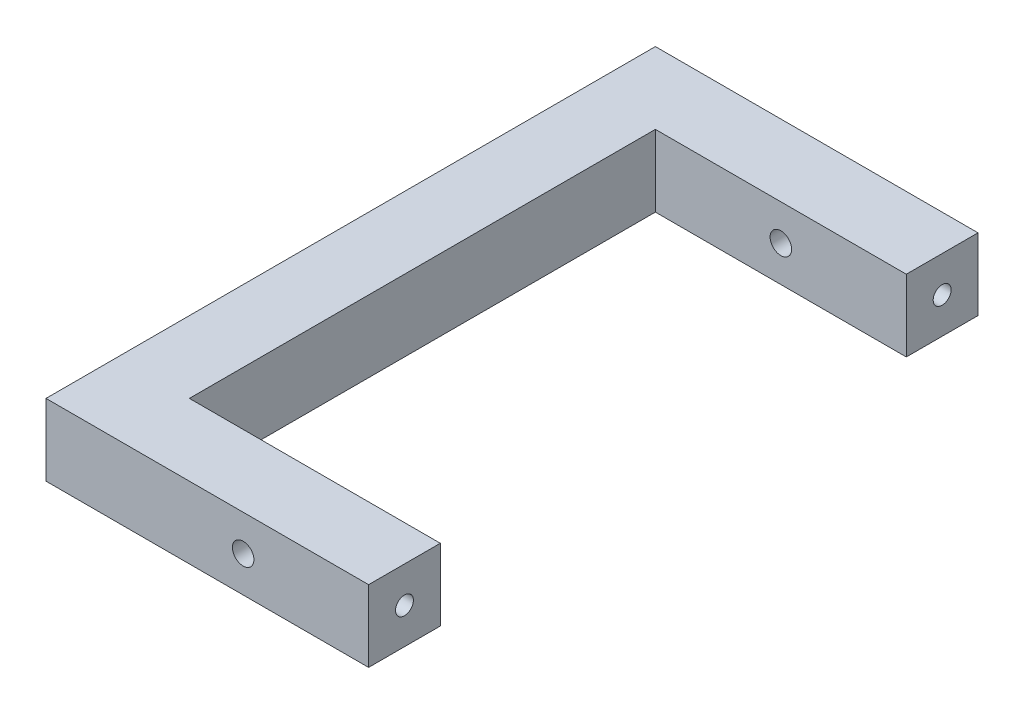
ISO-10303-21;
HEADER;
FILE_DESCRIPTION(('STEP AP214'),'2;1');
FILE_NAME('part.step','',(''),(''),'','','');
FILE_SCHEMA(('AUTOMOTIVE_DESIGN { 1 0 10303 214 1 1 1 1 }'));
ENDSEC;
DATA;
#1=APPLICATION_CONTEXT('core data for automotive mechanical design processes');
#2=APPLICATION_PROTOCOL_DEFINITION('international standard','automotive_design',2000,#1);
#3=PRODUCT_CONTEXT('',#1,'mechanical');
#4=PRODUCT('Part','Part','',(#3));
#5=PRODUCT_RELATED_PRODUCT_CATEGORY('part','',(#4));
#6=PRODUCT_DEFINITION_FORMATION('','',#4);
#7=PRODUCT_DEFINITION_CONTEXT('part definition',#1,'design');
#8=PRODUCT_DEFINITION('design','',#6,#7);
#9=PRODUCT_DEFINITION_SHAPE('','',#8);
#10=(LENGTH_UNIT() NAMED_UNIT(*) SI_UNIT(.MILLI.,.METRE.));
#11=(NAMED_UNIT(*) PLANE_ANGLE_UNIT() SI_UNIT($,.RADIAN.));
#12=(NAMED_UNIT(*) SI_UNIT($,.STERADIAN.) SOLID_ANGLE_UNIT());
#13=UNCERTAINTY_MEASURE_WITH_UNIT(LENGTH_MEASURE(1.E-05),#10,'distance_accuracy_value','');
#14=(GEOMETRIC_REPRESENTATION_CONTEXT(3) GLOBAL_UNCERTAINTY_ASSIGNED_CONTEXT((#13)) GLOBAL_UNIT_ASSIGNED_CONTEXT((#10,
#11,#12)) REPRESENTATION_CONTEXT('',''));
#15=CARTESIAN_POINT('',(0.,0.,0.));
#16=DIRECTION('',(0.,0.,1.));
#17=DIRECTION('',(1.,0.,0.));
#18=AXIS2_PLACEMENT_3D('',#15,#16,#17);
#19=CARTESIAN_POINT('',(0.,40.,-170.));
#20=DIRECTION('',(1.,0.,0.));
#21=DIRECTION('',(0.,0.,-1.));
#22=AXIS2_PLACEMENT_3D('',#19,#20,#21);
#23=PLANE('',#22);
#24=DIRECTION('',(0.,0.,1.));
#25=VECTOR('',#24,1.);
#26=CARTESIAN_POINT('',(0.,0.,-170.));
#27=LINE('',#26,#25);
#28=CARTESIAN_POINT('',(0.,0.,-170.));
#29=VERTEX_POINT('',#28);
#30=CARTESIAN_POINT('',(0.,0.,170.));
#31=VERTEX_POINT('',#30);
#32=EDGE_CURVE('E140',#29,#31,#27,.T.);
#33=ORIENTED_EDGE('',*,*,#32,.T.);
#34=DIRECTION('',(0.,-1.,0.));
#35=VECTOR('',#34,1.);
#36=CARTESIAN_POINT('',(0.,40.,170.));
#37=LINE('',#36,#35);
#38=CARTESIAN_POINT('',(0.,40.,170.));
#39=VERTEX_POINT('',#38);
#40=EDGE_CURVE('E11',#39,#31,#37,.T.);
#41=ORIENTED_EDGE('',*,*,#40,.F.);
#42=DIRECTION('',(0.,0.,1.));
#43=VECTOR('',#42,1.);
#44=CARTESIAN_POINT('',(0.,40.,-170.));
#45=LINE('',#44,#43);
#46=CARTESIAN_POINT('',(0.,40.,-170.));
#47=VERTEX_POINT('',#46);
#48=EDGE_CURVE('E155',#47,#39,#45,.T.);
#49=ORIENTED_EDGE('',*,*,#48,.F.);
#50=DIRECTION('',(0.,-1.,0.));
#51=VECTOR('',#50,1.);
#52=CARTESIAN_POINT('',(0.,40.,-170.));
#53=LINE('',#52,#51);
#54=EDGE_CURVE('E136',#47,#29,#53,.T.);
#55=ORIENTED_EDGE('',*,*,#54,.T.);
#56=EDGE_LOOP('',(#33,#41,#49,#55));
#57=FACE_BOUND('',#56,.T.);
#58=ADVANCED_FACE('F43',(#57),#23,.F.);
#59=CARTESIAN_POINT('',(0.,40.,170.));
#60=DIRECTION('',(0.,0.,-1.));
#61=DIRECTION('',(-1.,0.,0.));
#62=AXIS2_PLACEMENT_3D('',#59,#60,#61);
#63=PLANE('',#62);
#64=CARTESIAN_POINT('',(110.,20.,170.));
#65=DIRECTION('',(0.,0.,1.));
#66=DIRECTION('',(1.,0.,0.));
#67=AXIS2_PLACEMENT_3D('',#64,#65,#66);
#68=CIRCLE('',#67,6.00000000000002);
#69=CARTESIAN_POINT('',(116.,20.,170.));
#70=VERTEX_POINT('',#69);
#71=EDGE_CURVE('E194',#70,#70,#68,.T.);
#72=ORIENTED_EDGE('',*,*,#71,.F.);
#73=EDGE_LOOP('',(#72));
#74=FACE_BOUND('',#73,.T.);
#75=DIRECTION('',(1.,0.,0.));
#76=VECTOR('',#75,1.);
#77=CARTESIAN_POINT('',(0.,0.,170.));
#78=LINE('',#77,#76);
#79=CARTESIAN_POINT('',(180.,0.,170.));
#80=VERTEX_POINT('',#79);
#81=EDGE_CURVE('E143',#31,#80,#78,.T.);
#82=ORIENTED_EDGE('',*,*,#81,.T.);
#83=DIRECTION('',(0.,-1.,0.));
#84=VECTOR('',#83,1.);
#85=CARTESIAN_POINT('',(180.,40.,170.));
#86=LINE('',#85,#84);
#87=CARTESIAN_POINT('',(180.,40.,170.));
#88=VERTEX_POINT('',#87);
#89=EDGE_CURVE('E52',#88,#80,#86,.T.);
#90=ORIENTED_EDGE('',*,*,#89,.F.);
#91=DIRECTION('',(1.,0.,0.));
#92=VECTOR('',#91,1.);
#93=CARTESIAN_POINT('',(0.,40.,170.));
#94=LINE('',#93,#92);
#95=EDGE_CURVE('E103',#39,#88,#94,.T.);
#96=ORIENTED_EDGE('',*,*,#95,.F.);
#97=ORIENTED_EDGE('',*,*,#40,.T.);
#98=EDGE_LOOP('',(#82,#90,#96,#97));
#99=FACE_BOUND('',#98,.T.);
#100=ADVANCED_FACE('F220',(#74,#99),#63,.F.);
#101=CARTESIAN_POINT('',(180.,40.,170.));
#102=DIRECTION('',(-1.,0.,0.));
#103=DIRECTION('',(0.,0.,1.));
#104=AXIS2_PLACEMENT_3D('',#101,#102,#103);
#105=PLANE('',#104);
#106=CARTESIAN_POINT('',(180.,20.,150.));
#107=DIRECTION('',(1.,0.,0.));
#108=DIRECTION('',(0.,0.,-1.));
#109=AXIS2_PLACEMENT_3D('',#106,#107,#108);
#110=CIRCLE('',#109,5.00000000000002);
#111=CARTESIAN_POINT('',(180.,20.,145.));
#112=VERTEX_POINT('',#111);
#113=EDGE_CURVE('E204',#112,#112,#110,.T.);
#114=ORIENTED_EDGE('',*,*,#113,.F.);
#115=EDGE_LOOP('',(#114));
#116=FACE_BOUND('',#115,.T.);
#117=DIRECTION('',(0.,0.,-1.));
#118=VECTOR('',#117,1.);
#119=CARTESIAN_POINT('',(180.,0.,170.));
#120=LINE('',#119,#118);
#121=CARTESIAN_POINT('',(180.,0.,130.));
#122=VERTEX_POINT('',#121);
#123=EDGE_CURVE('E146',#80,#122,#120,.T.);
#124=ORIENTED_EDGE('',*,*,#123,.T.);
#125=DIRECTION('',(0.,-1.,0.));
#126=VECTOR('',#125,1.);
#127=CARTESIAN_POINT('',(180.,40.,130.));
#128=LINE('',#127,#126);
#129=CARTESIAN_POINT('',(180.,40.,130.));
#130=VERTEX_POINT('',#129);
#131=EDGE_CURVE('E162',#130,#122,#128,.T.);
#132=ORIENTED_EDGE('',*,*,#131,.F.);
#133=DIRECTION('',(0.,0.,-1.));
#134=VECTOR('',#133,1.);
#135=CARTESIAN_POINT('',(180.,40.,170.));
#136=LINE('',#135,#134);
#137=EDGE_CURVE('E171',#88,#130,#136,.T.);
#138=ORIENTED_EDGE('',*,*,#137,.F.);
#139=ORIENTED_EDGE('',*,*,#89,.T.);
#140=EDGE_LOOP('',(#124,#132,#138,#139));
#141=FACE_BOUND('',#140,.T.);
#142=ADVANCED_FACE('F169',(#116,#141),#105,.F.);
#143=CARTESIAN_POINT('',(180.,40.,130.));
#144=DIRECTION('',(0.,0.,1.));
#145=DIRECTION('',(1.,0.,0.));
#146=AXIS2_PLACEMENT_3D('',#143,#144,#145);
#147=PLANE('',#146);
#148=CARTESIAN_POINT('',(110.,20.,130.));
#149=DIRECTION('',(0.,0.,1.));
#150=DIRECTION('',(1.,0.,0.));
#151=AXIS2_PLACEMENT_3D('',#148,#149,#150);
#152=CIRCLE('',#151,6.00000000000002);
#153=CARTESIAN_POINT('',(116.,20.,130.));
#154=VERTEX_POINT('',#153);
#155=EDGE_CURVE('E144',#154,#154,#152,.T.);
#156=ORIENTED_EDGE('',*,*,#155,.T.);
#157=EDGE_LOOP('',(#156));
#158=FACE_BOUND('',#157,.T.);
#159=DIRECTION('',(-1.,0.,0.));
#160=VECTOR('',#159,1.);
#161=CARTESIAN_POINT('',(180.,0.,130.));
#162=LINE('',#161,#160);
#163=CARTESIAN_POINT('',(40.,0.,130.));
#164=VERTEX_POINT('',#163);
#165=EDGE_CURVE('E148',#122,#164,#162,.T.);
#166=ORIENTED_EDGE('',*,*,#165,.T.);
#167=DIRECTION('',(0.,-1.,0.));
#168=VECTOR('',#167,1.);
#169=CARTESIAN_POINT('',(40.,40.,130.));
#170=LINE('',#169,#168);
#171=CARTESIAN_POINT('',(40.,40.,130.));
#172=VERTEX_POINT('',#171);
#173=EDGE_CURVE('E159',#172,#164,#170,.T.);
#174=ORIENTED_EDGE('',*,*,#173,.F.);
#175=DIRECTION('',(-1.,0.,0.));
#176=VECTOR('',#175,1.);
#177=CARTESIAN_POINT('',(180.,40.,130.));
#178=LINE('',#177,#176);
#179=EDGE_CURVE('E183',#130,#172,#178,.T.);
#180=ORIENTED_EDGE('',*,*,#179,.F.);
#181=ORIENTED_EDGE('',*,*,#131,.T.);
#182=EDGE_LOOP('',(#166,#174,#180,#181));
#183=FACE_BOUND('',#182,.T.);
#184=ADVANCED_FACE('F179',(#158,#183),#147,.F.);
#185=CARTESIAN_POINT('',(40.,40.,-130.));
#186=DIRECTION('',(-1.,0.,0.));
#187=DIRECTION('',(0.,0.,1.));
#188=AXIS2_PLACEMENT_3D('',#185,#186,#187);
#189=PLANE('',#188);
#190=DIRECTION('',(0.,0.,-1.));
#191=VECTOR('',#190,1.);
#192=CARTESIAN_POINT('',(40.,0.,-130.));
#193=LINE('',#192,#191);
#194=CARTESIAN_POINT('',(40.,0.,-130.));
#195=VERTEX_POINT('',#194);
#196=EDGE_CURVE('E150',#164,#195,#193,.T.);
#197=ORIENTED_EDGE('',*,*,#196,.T.);
#198=DIRECTION('',(0.,-1.,0.));
#199=VECTOR('',#198,1.);
#200=CARTESIAN_POINT('',(40.,40.,-130.));
#201=LINE('',#200,#199);
#202=CARTESIAN_POINT('',(40.,40.,-130.));
#203=VERTEX_POINT('',#202);
#204=EDGE_CURVE('E131',#203,#195,#201,.T.);
#205=ORIENTED_EDGE('',*,*,#204,.F.);
#206=DIRECTION('',(0.,0.,-1.));
#207=VECTOR('',#206,1.);
#208=CARTESIAN_POINT('',(40.,40.,-130.));
#209=LINE('',#208,#207);
#210=EDGE_CURVE('E122',#172,#203,#209,.T.);
#211=ORIENTED_EDGE('',*,*,#210,.F.);
#212=ORIENTED_EDGE('',*,*,#173,.T.);
#213=EDGE_LOOP('',(#197,#205,#211,#212));
#214=FACE_BOUND('',#213,.T.);
#215=ADVANCED_FACE('F182',(#214),#189,.F.);
#216=CARTESIAN_POINT('',(180.,40.,-130.));
#217=DIRECTION('',(0.,0.,-1.));
#218=DIRECTION('',(-1.,0.,0.));
#219=AXIS2_PLACEMENT_3D('',#216,#217,#218);
#220=PLANE('',#219);
#221=CARTESIAN_POINT('',(110.,20.,-130.));
#222=DIRECTION('',(0.,0.,-1.));
#223=DIRECTION('',(-1.,0.,0.));
#224=AXIS2_PLACEMENT_3D('',#221,#222,#223);
#225=CIRCLE('',#224,6.00000000000002);
#226=CARTESIAN_POINT('',(104.,20.,-130.));
#227=VERTEX_POINT('',#226);
#228=EDGE_CURVE('E191',#227,#227,#225,.T.);
#229=ORIENTED_EDGE('',*,*,#228,.T.);
#230=EDGE_LOOP('',(#229));
#231=FACE_BOUND('',#230,.T.);
#232=DIRECTION('',(1.,0.,0.));
#233=VECTOR('',#232,1.);
#234=CARTESIAN_POINT('',(180.,0.,-130.));
#235=LINE('',#234,#233);
#236=CARTESIAN_POINT('',(180.,0.,-130.));
#237=VERTEX_POINT('',#236);
#238=EDGE_CURVE('E130',#195,#237,#235,.T.);
#239=ORIENTED_EDGE('',*,*,#238,.T.);
#240=DIRECTION('',(0.,-1.,0.));
#241=VECTOR('',#240,1.);
#242=CARTESIAN_POINT('',(180.,40.,-130.));
#243=LINE('',#242,#241);
#244=CARTESIAN_POINT('',(180.,40.,-130.));
#245=VERTEX_POINT('',#244);
#246=EDGE_CURVE('E127',#245,#237,#243,.T.);
#247=ORIENTED_EDGE('',*,*,#246,.F.);
#248=DIRECTION('',(1.,0.,0.));
#249=VECTOR('',#248,1.);
#250=CARTESIAN_POINT('',(180.,40.,-130.));
#251=LINE('',#250,#249);
#252=EDGE_CURVE('E116',#203,#245,#251,.T.);
#253=ORIENTED_EDGE('',*,*,#252,.F.);
#254=ORIENTED_EDGE('',*,*,#204,.T.);
#255=EDGE_LOOP('',(#239,#247,#253,#254));
#256=FACE_BOUND('',#255,.T.);
#257=ADVANCED_FACE('F128',(#231,#256),#220,.F.);
#258=CARTESIAN_POINT('',(180.,40.,-170.));
#259=DIRECTION('',(-1.,0.,0.));
#260=DIRECTION('',(0.,0.,1.));
#261=AXIS2_PLACEMENT_3D('',#258,#259,#260);
#262=PLANE('',#261);
#263=CARTESIAN_POINT('',(180.,20.,-150.));
#264=DIRECTION('',(1.,0.,0.));
#265=DIRECTION('',(0.,0.,1.));
#266=AXIS2_PLACEMENT_3D('',#263,#264,#265);
#267=CIRCLE('',#266,5.00000000000002);
#268=CARTESIAN_POINT('',(180.,20.,-145.));
#269=VERTEX_POINT('',#268);
#270=EDGE_CURVE('E201',#269,#269,#267,.T.);
#271=ORIENTED_EDGE('',*,*,#270,.F.);
#272=EDGE_LOOP('',(#271));
#273=FACE_BOUND('',#272,.T.);
#274=DIRECTION('',(0.,0.,-1.));
#275=VECTOR('',#274,1.);
#276=CARTESIAN_POINT('',(180.,0.,-170.));
#277=LINE('',#276,#275);
#278=CARTESIAN_POINT('',(180.,0.,-170.));
#279=VERTEX_POINT('',#278);
#280=EDGE_CURVE('E89',#237,#279,#277,.T.);
#281=ORIENTED_EDGE('',*,*,#280,.T.);
#282=DIRECTION('',(0.,-1.,0.));
#283=VECTOR('',#282,1.);
#284=CARTESIAN_POINT('',(180.,40.,-170.));
#285=LINE('',#284,#283);
#286=CARTESIAN_POINT('',(180.,40.,-170.));
#287=VERTEX_POINT('',#286);
#288=EDGE_CURVE('E132',#287,#279,#285,.T.);
#289=ORIENTED_EDGE('',*,*,#288,.F.);
#290=DIRECTION('',(0.,0.,-1.));
#291=VECTOR('',#290,1.);
#292=CARTESIAN_POINT('',(180.,40.,-170.));
#293=LINE('',#292,#291);
#294=EDGE_CURVE('E120',#245,#287,#293,.T.);
#295=ORIENTED_EDGE('',*,*,#294,.F.);
#296=ORIENTED_EDGE('',*,*,#246,.T.);
#297=EDGE_LOOP('',(#281,#289,#295,#296));
#298=FACE_BOUND('',#297,.T.);
#299=ADVANCED_FACE('F134',(#273,#298),#262,.F.);
#300=CARTESIAN_POINT('',(0.,40.,-170.));
#301=DIRECTION('',(0.,0.,1.));
#302=DIRECTION('',(1.,0.,0.));
#303=AXIS2_PLACEMENT_3D('',#300,#301,#302);
#304=PLANE('',#303);
#305=CARTESIAN_POINT('',(110.,20.,-170.));
#306=DIRECTION('',(0.,0.,1.));
#307=DIRECTION('',(1.,0.,0.));
#308=AXIS2_PLACEMENT_3D('',#305,#306,#307);
#309=CIRCLE('',#308,6.00000000000002);
#310=CARTESIAN_POINT('',(116.,20.,-170.));
#311=VERTEX_POINT('',#310);
#312=EDGE_CURVE('E46',#311,#311,#309,.T.);
#313=ORIENTED_EDGE('',*,*,#312,.T.);
#314=EDGE_LOOP('',(#313));
#315=FACE_BOUND('',#314,.T.);
#316=DIRECTION('',(-1.,0.,0.));
#317=VECTOR('',#316,1.);
#318=CARTESIAN_POINT('',(0.,0.,-170.));
#319=LINE('',#318,#317);
#320=EDGE_CURVE('E95',#279,#29,#319,.T.);
#321=ORIENTED_EDGE('',*,*,#320,.T.);
#322=ORIENTED_EDGE('',*,*,#54,.F.);
#323=DIRECTION('',(-1.,0.,0.));
#324=VECTOR('',#323,1.);
#325=CARTESIAN_POINT('',(0.,40.,-170.));
#326=LINE('',#325,#324);
#327=EDGE_CURVE('E60',#287,#47,#326,.T.);
#328=ORIENTED_EDGE('',*,*,#327,.F.);
#329=ORIENTED_EDGE('',*,*,#288,.T.);
#330=EDGE_LOOP('',(#321,#322,#328,#329));
#331=FACE_BOUND('',#330,.T.);
#332=ADVANCED_FACE('F238',(#315,#331),#304,.F.);
#333=CARTESIAN_POINT('',(0.,40.,0.));
#334=DIRECTION('',(0.,1.,0.));
#335=DIRECTION('',(0.,0.,1.));
#336=AXIS2_PLACEMENT_3D('',#333,#334,#335);
#337=PLANE('',#336);
#338=ORIENTED_EDGE('',*,*,#48,.T.);
#339=ORIENTED_EDGE('',*,*,#95,.T.);
#340=ORIENTED_EDGE('',*,*,#137,.T.);
#341=ORIENTED_EDGE('',*,*,#179,.T.);
#342=ORIENTED_EDGE('',*,*,#210,.T.);
#343=ORIENTED_EDGE('',*,*,#252,.T.);
#344=ORIENTED_EDGE('',*,*,#294,.T.);
#345=ORIENTED_EDGE('',*,*,#327,.T.);
#346=EDGE_LOOP('',(#338,#339,#340,#341,#342,#343,#344,#345));
#347=FACE_BOUND('',#346,.T.);
#348=ADVANCED_FACE('F118',(#347),#337,.T.);
#349=CARTESIAN_POINT('',(0.,0.,0.));
#350=DIRECTION('',(0.,1.,0.));
#351=DIRECTION('',(0.,0.,1.));
#352=AXIS2_PLACEMENT_3D('',#349,#350,#351);
#353=PLANE('',#352);
#354=ORIENTED_EDGE('',*,*,#32,.F.);
#355=ORIENTED_EDGE('',*,*,#320,.F.);
#356=ORIENTED_EDGE('',*,*,#280,.F.);
#357=ORIENTED_EDGE('',*,*,#238,.F.);
#358=ORIENTED_EDGE('',*,*,#196,.F.);
#359=ORIENTED_EDGE('',*,*,#165,.F.);
#360=ORIENTED_EDGE('',*,*,#123,.F.);
#361=ORIENTED_EDGE('',*,*,#81,.F.);
#362=EDGE_LOOP('',(#354,#355,#356,#357,#358,#359,#360,#361));
#363=FACE_BOUND('',#362,.T.);
#364=ADVANCED_FACE('F175',(#363),#353,.F.);
#365=CARTESIAN_POINT('',(110.,20.,-225.));
#366=DIRECTION('',(0.,0.,1.));
#367=DIRECTION('',(1.,0.,0.));
#368=AXIS2_PLACEMENT_3D('',#365,#366,#367);
#369=CYLINDRICAL_SURFACE('',#368,6.00000000000002);
#370=ORIENTED_EDGE('',*,*,#312,.F.);
#371=EDGE_LOOP('',(#370));
#372=FACE_BOUND('',#371,.T.);
#373=ORIENTED_EDGE('',*,*,#228,.F.);
#374=EDGE_LOOP('',(#373));
#375=FACE_BOUND('',#374,.T.);
#376=ADVANCED_FACE('F270',(#372,#375),#369,.F.);
#377=ORIENTED_EDGE('',*,*,#71,.T.);
#378=EDGE_LOOP('',(#377));
#379=FACE_BOUND('',#378,.T.);
#380=ORIENTED_EDGE('',*,*,#155,.F.);
#381=EDGE_LOOP('',(#380));
#382=FACE_BOUND('',#381,.T.);
#383=ADVANCED_FACE('F305',(#379,#382),#369,.F.);
#384=CARTESIAN_POINT('',(130.,20.,-150.));
#385=DIRECTION('',(1.,0.,0.));
#386=DIRECTION('',(0.,0.,-1.));
#387=AXIS2_PLACEMENT_3D('',#384,#385,#386);
#388=CYLINDRICAL_SURFACE('',#387,5.00000000000002);
#389=CARTESIAN_POINT('',(130.,20.,-150.));
#390=DIRECTION('',(1.,0.,0.));
#391=DIRECTION('',(0.,0.,1.));
#392=AXIS2_PLACEMENT_3D('',#389,#390,#391);
#393=CIRCLE('',#392,5.00000000000002);
#394=CARTESIAN_POINT('',(130.,20.,-145.));
#395=VERTEX_POINT('',#394);
#396=EDGE_CURVE('E198',#395,#395,#393,.T.);
#397=ORIENTED_EDGE('',*,*,#396,.F.);
#398=EDGE_LOOP('',(#397));
#399=FACE_BOUND('',#398,.T.);
#400=ORIENTED_EDGE('',*,*,#270,.T.);
#401=EDGE_LOOP('',(#400));
#402=FACE_BOUND('',#401,.T.);
#403=ADVANCED_FACE('F313',(#399,#402),#388,.F.);
#404=CARTESIAN_POINT('',(130.,20.,-150.));
#405=DIRECTION('',(-1.,0.,0.));
#406=DIRECTION('',(0.,0.,1.));
#407=AXIS2_PLACEMENT_3D('',#404,#405,#406);
#408=PLANE('',#407);
#409=ORIENTED_EDGE('',*,*,#396,.T.);
#410=EDGE_LOOP('',(#409));
#411=FACE_BOUND('',#410,.T.);
#412=ADVANCED_FACE('F215',(#411),#408,.F.);
#413=CARTESIAN_POINT('',(130.,20.,150.));
#414=DIRECTION('',(1.,0.,0.));
#415=DIRECTION('',(0.,0.,-1.));
#416=AXIS2_PLACEMENT_3D('',#413,#414,#415);
#417=CYLINDRICAL_SURFACE('',#416,5.00000000000002);
#418=CARTESIAN_POINT('',(130.,20.,150.));
#419=DIRECTION('',(1.,0.,0.));
#420=DIRECTION('',(0.,0.,-1.));
#421=AXIS2_PLACEMENT_3D('',#418,#419,#420);
#422=CIRCLE('',#421,5.00000000000002);
#423=CARTESIAN_POINT('',(130.,20.,145.));
#424=VERTEX_POINT('',#423);
#425=EDGE_CURVE('E197',#424,#424,#422,.T.);
#426=ORIENTED_EDGE('',*,*,#425,.F.);
#427=EDGE_LOOP('',(#426));
#428=FACE_BOUND('',#427,.T.);
#429=ORIENTED_EDGE('',*,*,#113,.T.);
#430=EDGE_LOOP('',(#429));
#431=FACE_BOUND('',#430,.T.);
#432=ADVANCED_FACE('F212',(#428,#431),#417,.F.);
#433=CARTESIAN_POINT('',(130.,20.,150.));
#434=DIRECTION('',(1.,0.,0.));
#435=DIRECTION('',(0.,0.,-1.));
#436=AXIS2_PLACEMENT_3D('',#433,#434,#435);
#437=PLANE('',#436);
#438=ORIENTED_EDGE('',*,*,#425,.T.);
#439=EDGE_LOOP('',(#438));
#440=FACE_BOUND('',#439,.T.);
#441=ADVANCED_FACE('F210',(#440),#437,.T.);
#442=CLOSED_SHELL('',(#58,#100,#142,#184,#215,#257,#299,#332,#348,#364,#376,#383,#403,#412,#432,#441));
#443=MANIFOLD_SOLID_BREP('B2',#442);
#444=ADVANCED_BREP_SHAPE_REPRESENTATION('',(#18,#443),#14);
#445=SHAPE_DEFINITION_REPRESENTATION(#9,#444);
ENDSEC;
END-ISO-10303-21;
